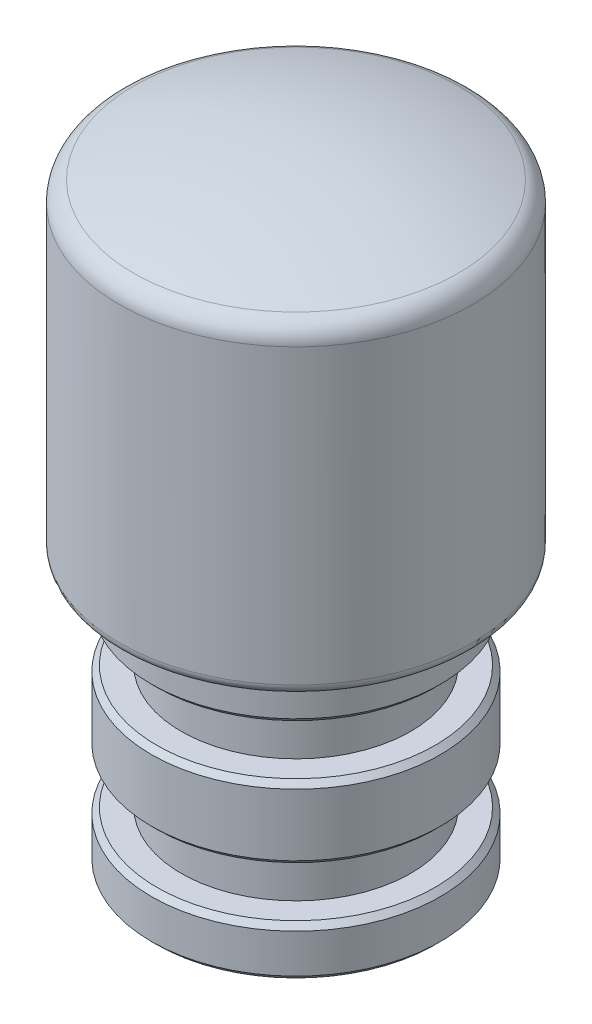
ISO-10303-21;
HEADER;
FILE_DESCRIPTION(('STEP AP214'),'2;1');
FILE_NAME('part.step','',(''),(''),'','','');
FILE_SCHEMA(('AUTOMOTIVE_DESIGN { 1 0 10303 214 1 1 1 1 }'));
ENDSEC;
DATA;
#1=APPLICATION_CONTEXT('core data for automotive mechanical design processes');
#2=APPLICATION_PROTOCOL_DEFINITION('international standard','automotive_design',2000,#1);
#3=PRODUCT_CONTEXT('',#1,'mechanical');
#4=PRODUCT('Part','Part','',(#3));
#5=PRODUCT_RELATED_PRODUCT_CATEGORY('part','',(#4));
#6=PRODUCT_DEFINITION_FORMATION('','',#4);
#7=PRODUCT_DEFINITION_CONTEXT('part definition',#1,'design');
#8=PRODUCT_DEFINITION('design','',#6,#7);
#9=PRODUCT_DEFINITION_SHAPE('','',#8);
#10=(LENGTH_UNIT() NAMED_UNIT(*) SI_UNIT(.MILLI.,.METRE.));
#11=(NAMED_UNIT(*) PLANE_ANGLE_UNIT() SI_UNIT($,.RADIAN.));
#12=(NAMED_UNIT(*) SI_UNIT($,.STERADIAN.) SOLID_ANGLE_UNIT());
#13=UNCERTAINTY_MEASURE_WITH_UNIT(LENGTH_MEASURE(1.E-05),#10,'distance_accuracy_value','');
#14=(GEOMETRIC_REPRESENTATION_CONTEXT(3) GLOBAL_UNCERTAINTY_ASSIGNED_CONTEXT((#13)) GLOBAL_UNIT_ASSIGNED_CONTEXT((#10,
#11,#12)) REPRESENTATION_CONTEXT('',''));
#15=CARTESIAN_POINT('',(0.,0.,0.));
#16=DIRECTION('',(0.,0.,1.));
#17=DIRECTION('',(1.,0.,0.));
#18=AXIS2_PLACEMENT_3D('',#15,#16,#17);
#19=CARTESIAN_POINT('',(0.,0.,0.));
#20=DIRECTION('',(0.,1.,0.));
#21=DIRECTION('',(0.,0.,1.));
#22=AXIS2_PLACEMENT_3D('',#19,#20,#21);
#23=PLANE('',#22);
#24=CARTESIAN_POINT('',(0.,0.,0.));
#25=DIRECTION('',(0.,1.,0.));
#26=DIRECTION('',(0.,0.,1.));
#27=AXIS2_PLACEMENT_3D('',#24,#25,#26);
#28=CIRCLE('',#27,13.);
#29=CARTESIAN_POINT('',(0.,0.,13.));
#30=VERTEX_POINT('',#29);
#31=EDGE_CURVE('E65',#30,#30,#28,.F.);
#32=ORIENTED_EDGE('',*,*,#31,.T.);
#33=EDGE_LOOP('',(#32));
#34=FACE_BOUND('',#33,.T.);
#35=CARTESIAN_POINT('',(0.,0.,0.));
#36=DIRECTION('',(0.,-1.,0.));
#37=DIRECTION('',(0.,0.,-1.));
#38=AXIS2_PLACEMENT_3D('',#35,#36,#37);
#39=CIRCLE('',#38,2.09999999999999);
#40=CARTESIAN_POINT('',(0.,0.,-2.09999999999999));
#41=VERTEX_POINT('',#40);
#42=EDGE_CURVE('E113',#41,#41,#39,.T.);
#43=ORIENTED_EDGE('',*,*,#42,.F.);
#44=EDGE_LOOP('',(#43));
#45=FACE_BOUND('',#44,.T.);
#46=ADVANCED_FACE('F45',(#34,#45),#23,.F.);
#47=CARTESIAN_POINT('',(0.,-29.1154086371947,0.));
#48=DIRECTION('',(0.,-1.,0.));
#49=DIRECTION('',(0.,0.,-1.));
#50=AXIS2_PLACEMENT_3D('',#47,#48,#49);
#51=CYLINDRICAL_SURFACE('',#50,13.5);
#52=CARTESIAN_POINT('',(0.,21.34,0.));
#53=DIRECTION('',(0.,1.,0.));
#54=DIRECTION('',(0.,0.,1.));
#55=AXIS2_PLACEMENT_3D('',#52,#53,#54);
#56=CIRCLE('',#55,13.5);
#57=CARTESIAN_POINT('',(0.,21.34,13.5));
#58=VERTEX_POINT('',#57);
#59=EDGE_CURVE('E89',#58,#58,#56,.T.);
#60=ORIENTED_EDGE('',*,*,#59,.T.);
#61=EDGE_LOOP('',(#60));
#62=FACE_BOUND('',#61,.T.);
#63=CARTESIAN_POINT('',(0.,25.1999999999997,0.));
#64=DIRECTION('',(0.,1.,0.));
#65=DIRECTION('',(0.,0.,1.));
#66=AXIS2_PLACEMENT_3D('',#63,#64,#65);
#67=CIRCLE('',#66,13.5);
#68=CARTESIAN_POINT('',(0.,25.1999999999997,13.5));
#69=VERTEX_POINT('',#68);
#70=EDGE_CURVE('E107',#69,#69,#67,.T.);
#71=ORIENTED_EDGE('',*,*,#70,.F.);
#72=EDGE_LOOP('',(#71));
#73=FACE_BOUND('',#72,.T.);
#74=ADVANCED_FACE('F120',(#62,#73),#51,.T.);
#75=CARTESIAN_POINT('',(-13.5,20.84,0.));
#76=DIRECTION('',(0.,1.,0.));
#77=DIRECTION('',(0.,0.,1.));
#78=AXIS2_PLACEMENT_3D('',#75,#76,#77);
#79=PLANE('',#78);
#80=CARTESIAN_POINT('',(0.,20.84,0.));
#81=DIRECTION('',(0.,1.,0.));
#82=DIRECTION('',(0.,0.,1.));
#83=AXIS2_PLACEMENT_3D('',#80,#81,#82);
#84=CIRCLE('',#83,13.);
#85=CARTESIAN_POINT('',(0.,20.84,13.));
#86=VERTEX_POINT('',#85);
#87=EDGE_CURVE('E92',#86,#86,#84,.F.);
#88=ORIENTED_EDGE('',*,*,#87,.T.);
#89=EDGE_LOOP('',(#88));
#90=FACE_BOUND('',#89,.T.);
#91=CARTESIAN_POINT('',(0.,20.84,0.));
#92=DIRECTION('',(0.,-1.,0.));
#93=DIRECTION('',(0.,0.,-1.));
#94=AXIS2_PLACEMENT_3D('',#91,#92,#93);
#95=CIRCLE('',#94,10.73);
#96=CARTESIAN_POINT('',(0.,20.84,-10.73));
#97=VERTEX_POINT('',#96);
#98=EDGE_CURVE('E95',#97,#97,#95,.T.);
#99=ORIENTED_EDGE('',*,*,#98,.F.);
#100=EDGE_LOOP('',(#99));
#101=FACE_BOUND('',#100,.T.);
#102=ADVANCED_FACE('F126',(#90,#101),#79,.F.);
#103=CARTESIAN_POINT('',(0.,-29.1154086371947,0.));
#104=DIRECTION('',(0.,-1.,0.));
#105=DIRECTION('',(0.,0.,-1.));
#106=AXIS2_PLACEMENT_3D('',#103,#104,#105);
#107=CYLINDRICAL_SURFACE('',#106,10.73);
#108=CARTESIAN_POINT('',(0.,16.14,0.));
#109=DIRECTION('',(0.,-1.,0.));
#110=DIRECTION('',(0.,0.,-1.));
#111=AXIS2_PLACEMENT_3D('',#108,#109,#110);
#112=CIRCLE('',#111,10.73);
#113=CARTESIAN_POINT('',(0.,16.14,-10.73));
#114=VERTEX_POINT('',#113);
#115=EDGE_CURVE('E98',#114,#114,#112,.T.);
#116=ORIENTED_EDGE('',*,*,#115,.F.);
#117=EDGE_LOOP('',(#116));
#118=FACE_BOUND('',#117,.T.);
#119=ORIENTED_EDGE('',*,*,#98,.T.);
#120=EDGE_LOOP('',(#119));
#121=FACE_BOUND('',#120,.T.);
#122=ADVANCED_FACE('F157',(#118,#121),#107,.T.);
#123=CARTESIAN_POINT('',(-10.73,16.14,0.));
#124=DIRECTION('',(0.,-1.,0.));
#125=DIRECTION('',(0.,0.,-1.));
#126=AXIS2_PLACEMENT_3D('',#123,#124,#125);
#127=PLANE('',#126);
#128=CARTESIAN_POINT('',(0.,16.14,0.));
#129=DIRECTION('',(0.,-1.,0.));
#130=DIRECTION('',(0.,0.,-1.));
#131=AXIS2_PLACEMENT_3D('',#128,#129,#130);
#132=CIRCLE('',#131,13.);
#133=CARTESIAN_POINT('',(0.,16.14,-13.));
#134=VERTEX_POINT('',#133);
#135=EDGE_CURVE('E80',#134,#134,#132,.F.);
#136=ORIENTED_EDGE('',*,*,#135,.T.);
#137=EDGE_LOOP('',(#136));
#138=FACE_BOUND('',#137,.T.);
#139=ORIENTED_EDGE('',*,*,#115,.T.);
#140=EDGE_LOOP('',(#139));
#141=FACE_BOUND('',#140,.T.);
#142=ADVANCED_FACE('F153',(#138,#141),#127,.F.);
#143=CARTESIAN_POINT('',(0.,-29.1154086371947,0.));
#144=DIRECTION('',(0.,-1.,0.));
#145=DIRECTION('',(0.,0.,-1.));
#146=AXIS2_PLACEMENT_3D('',#143,#144,#145);
#147=CYLINDRICAL_SURFACE('',#146,13.5);
#148=CARTESIAN_POINT('',(0.,15.64,0.));
#149=DIRECTION('',(0.,-1.,0.));
#150=DIRECTION('',(0.,0.,-1.));
#151=AXIS2_PLACEMENT_3D('',#148,#149,#150);
#152=CIRCLE('',#151,13.5);
#153=CARTESIAN_POINT('',(0.,15.64,-13.5));
#154=VERTEX_POINT('',#153);
#155=EDGE_CURVE('E83',#154,#154,#152,.T.);
#156=ORIENTED_EDGE('',*,*,#155,.T.);
#157=EDGE_LOOP('',(#156));
#158=FACE_BOUND('',#157,.T.);
#159=CARTESIAN_POINT('',(0.,9.83999999999999,0.));
#160=DIRECTION('',(0.,1.,0.));
#161=DIRECTION('',(0.,0.,1.));
#162=AXIS2_PLACEMENT_3D('',#159,#160,#161);
#163=CIRCLE('',#162,13.5);
#164=CARTESIAN_POINT('',(0.,9.83999999999999,13.5));
#165=VERTEX_POINT('',#164);
#166=EDGE_CURVE('E86',#165,#165,#163,.T.);
#167=ORIENTED_EDGE('',*,*,#166,.T.);
#168=EDGE_LOOP('',(#167));
#169=FACE_BOUND('',#168,.T.);
#170=ADVANCED_FACE('F149',(#158,#169),#147,.T.);
#171=CARTESIAN_POINT('',(-13.5,9.34,0.));
#172=DIRECTION('',(0.,1.,0.));
#173=DIRECTION('',(0.,0.,1.));
#174=AXIS2_PLACEMENT_3D('',#171,#172,#173);
#175=PLANE('',#174);
#176=CARTESIAN_POINT('',(0.,9.34,0.));
#177=DIRECTION('',(0.,1.,0.));
#178=DIRECTION('',(0.,0.,1.));
#179=AXIS2_PLACEMENT_3D('',#176,#177,#178);
#180=CIRCLE('',#179,13.);
#181=CARTESIAN_POINT('',(0.,9.34,13.));
#182=VERTEX_POINT('',#181);
#183=EDGE_CURVE('E77',#182,#182,#180,.F.);
#184=ORIENTED_EDGE('',*,*,#183,.T.);
#185=EDGE_LOOP('',(#184));
#186=FACE_BOUND('',#185,.T.);
#187=CARTESIAN_POINT('',(0.,9.33999999999999,0.));
#188=DIRECTION('',(0.,-1.,0.));
#189=DIRECTION('',(0.,0.,-1.));
#190=AXIS2_PLACEMENT_3D('',#187,#188,#189);
#191=CIRCLE('',#190,10.73);
#192=CARTESIAN_POINT('',(0.,9.33999999999999,-10.73));
#193=VERTEX_POINT('',#192);
#194=EDGE_CURVE('E101',#193,#193,#191,.T.);
#195=ORIENTED_EDGE('',*,*,#194,.F.);
#196=EDGE_LOOP('',(#195));
#197=FACE_BOUND('',#196,.T.);
#198=ADVANCED_FACE('F145',(#186,#197),#175,.F.);
#199=CARTESIAN_POINT('',(0.,-29.1154086371947,0.));
#200=DIRECTION('',(0.,-1.,0.));
#201=DIRECTION('',(0.,0.,-1.));
#202=AXIS2_PLACEMENT_3D('',#199,#200,#201);
#203=CYLINDRICAL_SURFACE('',#202,10.73);
#204=CARTESIAN_POINT('',(0.,4.64,0.));
#205=DIRECTION('',(0.,-1.,0.));
#206=DIRECTION('',(0.,0.,-1.));
#207=AXIS2_PLACEMENT_3D('',#204,#205,#206);
#208=CIRCLE('',#207,10.73);
#209=CARTESIAN_POINT('',(0.,4.64,-10.73));
#210=VERTEX_POINT('',#209);
#211=EDGE_CURVE('E104',#210,#210,#208,.T.);
#212=ORIENTED_EDGE('',*,*,#211,.F.);
#213=EDGE_LOOP('',(#212));
#214=FACE_BOUND('',#213,.T.);
#215=ORIENTED_EDGE('',*,*,#194,.T.);
#216=EDGE_LOOP('',(#215));
#217=FACE_BOUND('',#216,.T.);
#218=ADVANCED_FACE('F141',(#214,#217),#203,.T.);
#219=CARTESIAN_POINT('',(-10.73,4.64,0.));
#220=DIRECTION('',(0.,-1.,0.));
#221=DIRECTION('',(0.,0.,-1.));
#222=AXIS2_PLACEMENT_3D('',#219,#220,#221);
#223=PLANE('',#222);
#224=CARTESIAN_POINT('',(0.,4.64,0.));
#225=DIRECTION('',(0.,-1.,0.));
#226=DIRECTION('',(0.,0.,-1.));
#227=AXIS2_PLACEMENT_3D('',#224,#225,#226);
#228=CIRCLE('',#227,13.);
#229=CARTESIAN_POINT('',(0.,4.64,-13.));
#230=VERTEX_POINT('',#229);
#231=EDGE_CURVE('E68',#230,#230,#228,.F.);
#232=ORIENTED_EDGE('',*,*,#231,.T.);
#233=EDGE_LOOP('',(#232));
#234=FACE_BOUND('',#233,.T.);
#235=ORIENTED_EDGE('',*,*,#211,.T.);
#236=EDGE_LOOP('',(#235));
#237=FACE_BOUND('',#236,.T.);
#238=ADVANCED_FACE('F137',(#234,#237),#223,.F.);
#239=CARTESIAN_POINT('',(0.,-29.1154086371947,0.));
#240=DIRECTION('',(0.,-1.,0.));
#241=DIRECTION('',(0.,0.,-1.));
#242=AXIS2_PLACEMENT_3D('',#239,#240,#241);
#243=CYLINDRICAL_SURFACE('',#242,13.5);
#244=CARTESIAN_POINT('',(0.,4.14,0.));
#245=DIRECTION('',(0.,-1.,0.));
#246=DIRECTION('',(0.,0.,-1.));
#247=AXIS2_PLACEMENT_3D('',#244,#245,#246);
#248=CIRCLE('',#247,13.5);
#249=CARTESIAN_POINT('',(0.,4.14,-13.5));
#250=VERTEX_POINT('',#249);
#251=EDGE_CURVE('E71',#250,#250,#248,.T.);
#252=ORIENTED_EDGE('',*,*,#251,.T.);
#253=EDGE_LOOP('',(#252));
#254=FACE_BOUND('',#253,.T.);
#255=CARTESIAN_POINT('',(0.,0.500000000000007,0.));
#256=DIRECTION('',(0.,1.,0.));
#257=DIRECTION('',(0.,0.,1.));
#258=AXIS2_PLACEMENT_3D('',#255,#256,#257);
#259=CIRCLE('',#258,13.5);
#260=CARTESIAN_POINT('',(0.,0.500000000000007,13.5));
#261=VERTEX_POINT('',#260);
#262=EDGE_CURVE('E74',#261,#261,#259,.T.);
#263=ORIENTED_EDGE('',*,*,#262,.T.);
#264=EDGE_LOOP('',(#263));
#265=FACE_BOUND('',#264,.T.);
#266=ADVANCED_FACE('F133',(#254,#265),#243,.T.);
#267=CARTESIAN_POINT('',(0.,20.84,0.));
#268=DIRECTION('',(0.,1.,0.));
#269=DIRECTION('',(0.,0.,1.));
#270=AXIS2_PLACEMENT_3D('',#267,#268,#269);
#271=CONICAL_SURFACE('',#270,13.,0.785398163397441);
#272=ORIENTED_EDGE('',*,*,#59,.F.);
#273=EDGE_LOOP('',(#272));
#274=FACE_BOUND('',#273,.T.);
#275=ORIENTED_EDGE('',*,*,#87,.F.);
#276=EDGE_LOOP('',(#275));
#277=FACE_BOUND('',#276,.T.);
#278=ADVANCED_FACE('F136',(#274,#277),#271,.T.);
#279=CARTESIAN_POINT('',(0.,15.64,0.));
#280=DIRECTION('',(0.,-1.,0.));
#281=DIRECTION('',(0.,0.,-1.));
#282=AXIS2_PLACEMENT_3D('',#279,#280,#281);
#283=CONICAL_SURFACE('',#282,13.5,0.785398163397452);
#284=ORIENTED_EDGE('',*,*,#135,.F.);
#285=EDGE_LOOP('',(#284));
#286=FACE_BOUND('',#285,.T.);
#287=ORIENTED_EDGE('',*,*,#155,.F.);
#288=EDGE_LOOP('',(#287));
#289=FACE_BOUND('',#288,.T.);
#290=ADVANCED_FACE('F171',(#286,#289),#283,.T.);
#291=CARTESIAN_POINT('',(0.,9.33999999999999,0.));
#292=DIRECTION('',(0.,1.,0.));
#293=DIRECTION('',(0.,0.,1.));
#294=AXIS2_PLACEMENT_3D('',#291,#292,#293);
#295=CONICAL_SURFACE('',#294,13.,0.785398163397445);
#296=ORIENTED_EDGE('',*,*,#166,.F.);
#297=EDGE_LOOP('',(#296));
#298=FACE_BOUND('',#297,.T.);
#299=ORIENTED_EDGE('',*,*,#183,.F.);
#300=EDGE_LOOP('',(#299));
#301=FACE_BOUND('',#300,.T.);
#302=ADVANCED_FACE('F178',(#298,#301),#295,.T.);
#303=CARTESIAN_POINT('',(0.,4.14,0.));
#304=DIRECTION('',(0.,-1.,0.));
#305=DIRECTION('',(0.,0.,-1.));
#306=AXIS2_PLACEMENT_3D('',#303,#304,#305);
#307=CONICAL_SURFACE('',#306,13.5,0.785398163397448);
#308=ORIENTED_EDGE('',*,*,#231,.F.);
#309=EDGE_LOOP('',(#308));
#310=FACE_BOUND('',#309,.T.);
#311=ORIENTED_EDGE('',*,*,#251,.F.);
#312=EDGE_LOOP('',(#311));
#313=FACE_BOUND('',#312,.T.);
#314=ADVANCED_FACE('F185',(#310,#313),#307,.T.);
#315=CARTESIAN_POINT('',(0.,0.,0.));
#316=DIRECTION('',(0.,1.,0.));
#317=DIRECTION('',(0.,0.,1.));
#318=AXIS2_PLACEMENT_3D('',#315,#316,#317);
#319=CONICAL_SURFACE('',#318,13.,0.785398163397445);
#320=ORIENTED_EDGE('',*,*,#262,.F.);
#321=EDGE_LOOP('',(#320));
#322=FACE_BOUND('',#321,.T.);
#323=ORIENTED_EDGE('',*,*,#31,.F.);
#324=EDGE_LOOP('',(#323));
#325=FACE_BOUND('',#324,.T.);
#326=ADVANCED_FACE('F192',(#322,#325),#319,.T.);
#327=CARTESIAN_POINT('',(1.68159756952502E-13,13.0999999999997,0.));
#328=DIRECTION('',(0.,-1.,0.));
#329=DIRECTION('',(-1.,0.,0.));
#330=AXIS2_PLACEMENT_3D('',#327,#328,#329);
#331=SPHERICAL_SURFACE('',#330,45.);
#332=CARTESIAN_POINT('',(1.68159756952502E-13,55.4643366525524,0.));
#333=DIRECTION('',(0.,-1.,0.));
#334=DIRECTION('',(0.,0.,-1.));
#335=AXIS2_PLACEMENT_3D('',#332,#333,#334);
#336=CIRCLE('',#335,15.1744186046512);
#337=CARTESIAN_POINT('',(1.68159756952502E-13,55.4643366525524,-15.1744186046512));
#338=VERTEX_POINT('',#337);
#339=EDGE_CURVE('E56',#338,#338,#336,.F.);
#340=ORIENTED_EDGE('',*,*,#339,.T.);
#341=EDGE_LOOP('',(#340));
#342=FACE_BOUND('',#341,.T.);
#343=ADVANCED_FACE('F131',(#342),#331,.T.);
#344=CARTESIAN_POINT('',(-16.5,25.1999999999997,0.));
#345=DIRECTION('',(0.,1.,0.));
#346=DIRECTION('',(0.,0.,1.));
#347=AXIS2_PLACEMENT_3D('',#344,#345,#346);
#348=PLANE('',#347);
#349=CARTESIAN_POINT('',(0.,25.1999999999997,0.));
#350=DIRECTION('',(0.,1.,0.));
#351=DIRECTION('',(0.,0.,1.));
#352=AXIS2_PLACEMENT_3D('',#349,#350,#351);
#353=CIRCLE('',#352,15.5);
#354=CARTESIAN_POINT('',(0.,25.1999999999997,15.5));
#355=VERTEX_POINT('',#354);
#356=EDGE_CURVE('E52',#355,#355,#353,.F.);
#357=ORIENTED_EDGE('',*,*,#356,.T.);
#358=EDGE_LOOP('',(#357));
#359=FACE_BOUND('',#358,.T.);
#360=ORIENTED_EDGE('',*,*,#70,.T.);
#361=EDGE_LOOP('',(#360));
#362=FACE_BOUND('',#361,.T.);
#363=ADVANCED_FACE('F208',(#359,#362),#348,.F.);
#364=CARTESIAN_POINT('',(0.,0.,0.));
#365=DIRECTION('',(0.,-1.,0.));
#366=DIRECTION('',(0.,0.,-1.));
#367=AXIS2_PLACEMENT_3D('',#364,#365,#366);
#368=CYLINDRICAL_SURFACE('',#367,16.5);
#369=CARTESIAN_POINT('',(0.,26.1999999999997,0.));
#370=DIRECTION('',(0.,1.,0.));
#371=DIRECTION('',(0.,0.,1.));
#372=AXIS2_PLACEMENT_3D('',#369,#370,#371);
#373=CIRCLE('',#372,16.5);
#374=CARTESIAN_POINT('',(0.,26.1999999999997,16.5));
#375=VERTEX_POINT('',#374);
#376=EDGE_CURVE('E10',#375,#375,#373,.T.);
#377=ORIENTED_EDGE('',*,*,#376,.T.);
#378=EDGE_LOOP('',(#377));
#379=FACE_BOUND('',#378,.T.);
#380=CARTESIAN_POINT('',(0.,53.5814772457723,0.));
#381=DIRECTION('',(0.,-1.,0.));
#382=DIRECTION('',(0.,0.,-1.));
#383=AXIS2_PLACEMENT_3D('',#380,#381,#382);
#384=CIRCLE('',#383,16.5);
#385=CARTESIAN_POINT('',(0.,53.5814772457723,-16.5));
#386=VERTEX_POINT('',#385);
#387=EDGE_CURVE('E60',#386,#386,#384,.T.);
#388=ORIENTED_EDGE('',*,*,#387,.T.);
#389=EDGE_LOOP('',(#388));
#390=FACE_BOUND('',#389,.T.);
#391=ADVANCED_FACE('F200',(#379,#390),#368,.T.);
#392=CARTESIAN_POINT('',(0.,53.5814772457723,0.));
#393=DIRECTION('',(0.,-1.,0.));
#394=DIRECTION('',(0.,0.,-1.));
#395=AXIS2_PLACEMENT_3D('',#392,#393,#394);
#396=TOROIDAL_SURFACE('',#395,14.5,2.);
#397=ORIENTED_EDGE('',*,*,#339,.F.);
#398=EDGE_LOOP('',(#397));
#399=FACE_BOUND('',#398,.T.);
#400=ORIENTED_EDGE('',*,*,#387,.F.);
#401=EDGE_LOOP('',(#400));
#402=FACE_BOUND('',#401,.T.);
#403=ADVANCED_FACE('F198',(#399,#402),#396,.T.);
#404=CARTESIAN_POINT('',(0.,26.1999999999997,0.));
#405=DIRECTION('',(0.,1.,0.));
#406=DIRECTION('',(0.,0.,1.));
#407=AXIS2_PLACEMENT_3D('',#404,#405,#406);
#408=TOROIDAL_SURFACE('',#407,15.5,1.);
#409=ORIENTED_EDGE('',*,*,#376,.F.);
#410=EDGE_LOOP('',(#409));
#411=FACE_BOUND('',#410,.T.);
#412=ORIENTED_EDGE('',*,*,#356,.F.);
#413=EDGE_LOOP('',(#412));
#414=FACE_BOUND('',#413,.T.);
#415=ADVANCED_FACE('F47',(#411,#414),#408,.T.);
#416=CARTESIAN_POINT('',(0.,14.,0.));
#417=DIRECTION('',(0.,1.,0.));
#418=DIRECTION('',(0.,0.,1.));
#419=AXIS2_PLACEMENT_3D('',#416,#417,#418);
#420=PLANE('',#419);
#421=CARTESIAN_POINT('',(0.,14.,0.));
#422=DIRECTION('',(0.,-1.,0.));
#423=DIRECTION('',(0.,0.,-1.));
#424=AXIS2_PLACEMENT_3D('',#421,#422,#423);
#425=CIRCLE('',#424,2.09999999999999);
#426=CARTESIAN_POINT('',(0.,14.,-2.09999999999999));
#427=VERTEX_POINT('',#426);
#428=EDGE_CURVE('E110',#427,#427,#425,.T.);
#429=ORIENTED_EDGE('',*,*,#428,.T.);
#430=EDGE_LOOP('',(#429));
#431=FACE_BOUND('',#430,.T.);
#432=ADVANCED_FACE('F206',(#431),#420,.F.);
#433=CARTESIAN_POINT('',(0.,0.,0.));
#434=DIRECTION('',(0.,-1.,0.));
#435=DIRECTION('',(0.,0.,-1.));
#436=AXIS2_PLACEMENT_3D('',#433,#434,#435);
#437=CYLINDRICAL_SURFACE('',#436,2.09999999999999);
#438=ORIENTED_EDGE('',*,*,#428,.F.);
#439=EDGE_LOOP('',(#438));
#440=FACE_BOUND('',#439,.T.);
#441=ORIENTED_EDGE('',*,*,#42,.T.);
#442=EDGE_LOOP('',(#441));
#443=FACE_BOUND('',#442,.T.);
#444=ADVANCED_FACE('F117',(#440,#443),#437,.F.);
#445=CLOSED_SHELL('',(#46,#74,#102,#122,#142,#170,#198,#218,#238,#266,#278,#290,#302,#314,#326,
#343,#363,#391,#403,#415,#432,#444));
#446=MANIFOLD_SOLID_BREP('B2',#445);
#447=ADVANCED_BREP_SHAPE_REPRESENTATION('',(#18,#446),#14);
#448=SHAPE_DEFINITION_REPRESENTATION(#9,#447);
ENDSEC;
END-ISO-10303-21;
